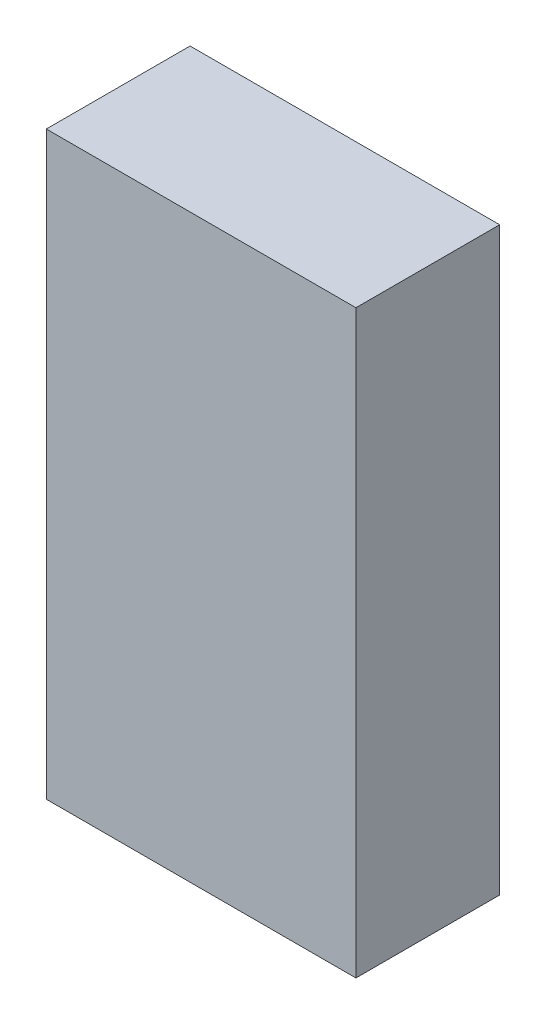
ISO-10303-21;
HEADER;
FILE_DESCRIPTION(('STEP AP214'),'2;1');
FILE_NAME('part.step','',(''),(''),'','','');
FILE_SCHEMA(('AUTOMOTIVE_DESIGN { 1 0 10303 214 1 1 1 1 }'));
ENDSEC;
DATA;
#1=APPLICATION_CONTEXT('core data for automotive mechanical design processes');
#2=APPLICATION_PROTOCOL_DEFINITION('international standard','automotive_design',2000,#1);
#3=PRODUCT_CONTEXT('',#1,'mechanical');
#4=PRODUCT('Part','Part','',(#3));
#5=PRODUCT_RELATED_PRODUCT_CATEGORY('part','',(#4));
#6=PRODUCT_DEFINITION_FORMATION('','',#4);
#7=PRODUCT_DEFINITION_CONTEXT('part definition',#1,'design');
#8=PRODUCT_DEFINITION('design','',#6,#7);
#9=PRODUCT_DEFINITION_SHAPE('','',#8);
#10=(LENGTH_UNIT() NAMED_UNIT(*) SI_UNIT(.MILLI.,.METRE.));
#11=(NAMED_UNIT(*) PLANE_ANGLE_UNIT() SI_UNIT($,.RADIAN.));
#12=(NAMED_UNIT(*) SI_UNIT($,.STERADIAN.) SOLID_ANGLE_UNIT());
#13=UNCERTAINTY_MEASURE_WITH_UNIT(LENGTH_MEASURE(1.E-05),#10,'distance_accuracy_value','');
#14=(GEOMETRIC_REPRESENTATION_CONTEXT(3) GLOBAL_UNCERTAINTY_ASSIGNED_CONTEXT((#13)) GLOBAL_UNIT_ASSIGNED_CONTEXT((#10,
#11,#12)) REPRESENTATION_CONTEXT('',''));
#15=CARTESIAN_POINT('',(0.,0.,0.));
#16=DIRECTION('',(0.,0.,1.));
#17=DIRECTION('',(1.,0.,0.));
#18=AXIS2_PLACEMENT_3D('',#15,#16,#17);
#19=CARTESIAN_POINT('',(-56.,105.,52.));
#20=DIRECTION('',(1.,0.,0.));
#21=DIRECTION('',(0.,1.,0.));
#22=AXIS2_PLACEMENT_3D('',#19,#20,#21);
#23=PLANE('',#22);
#24=DIRECTION('',(0.,-1.,0.));
#25=VECTOR('',#24,1.);
#26=CARTESIAN_POINT('',(-56.,105.,0.));
#27=LINE('',#26,#25);
#28=CARTESIAN_POINT('',(-56.,105.,0.));
#29=VERTEX_POINT('',#28);
#30=CARTESIAN_POINT('',(-56.,-105.,0.));
#31=VERTEX_POINT('',#30);
#32=EDGE_CURVE('E97',#29,#31,#27,.T.);
#33=ORIENTED_EDGE('',*,*,#32,.T.);
#34=DIRECTION('',(0.,0.,-1.));
#35=VECTOR('',#34,1.);
#36=CARTESIAN_POINT('',(-56.,-105.,52.));
#37=LINE('',#36,#35);
#38=CARTESIAN_POINT('',(-56.,-105.,52.));
#39=VERTEX_POINT('',#38);
#40=EDGE_CURVE('E11',#39,#31,#37,.T.);
#41=ORIENTED_EDGE('',*,*,#40,.F.);
#42=DIRECTION('',(0.,-1.,0.));
#43=VECTOR('',#42,1.);
#44=CARTESIAN_POINT('',(-56.,105.,52.));
#45=LINE('',#44,#43);
#46=CARTESIAN_POINT('',(-56.,105.,52.));
#47=VERTEX_POINT('',#46);
#48=EDGE_CURVE('E85',#47,#39,#45,.T.);
#49=ORIENTED_EDGE('',*,*,#48,.F.);
#50=DIRECTION('',(0.,0.,-1.));
#51=VECTOR('',#50,1.);
#52=CARTESIAN_POINT('',(-56.,105.,52.));
#53=LINE('',#52,#51);
#54=EDGE_CURVE('E93',#47,#29,#53,.T.);
#55=ORIENTED_EDGE('',*,*,#54,.T.);
#56=EDGE_LOOP('',(#33,#41,#49,#55));
#57=FACE_BOUND('',#56,.T.);
#58=ADVANCED_FACE('F34',(#57),#23,.F.);
#59=CARTESIAN_POINT('',(-56.,-105.,52.));
#60=DIRECTION('',(0.,1.,0.));
#61=DIRECTION('',(0.,0.,1.));
#62=AXIS2_PLACEMENT_3D('',#59,#60,#61);
#63=PLANE('',#62);
#64=DIRECTION('',(1.,0.,0.));
#65=VECTOR('',#64,1.);
#66=CARTESIAN_POINT('',(-56.,-105.,0.));
#67=LINE('',#66,#65);
#68=CARTESIAN_POINT('',(56.,-105.,0.));
#69=VERTEX_POINT('',#68);
#70=EDGE_CURVE('E89',#31,#69,#67,.T.);
#71=ORIENTED_EDGE('',*,*,#70,.T.);
#72=DIRECTION('',(0.,0.,-1.));
#73=VECTOR('',#72,1.);
#74=CARTESIAN_POINT('',(56.,-105.,52.));
#75=LINE('',#74,#73);
#76=CARTESIAN_POINT('',(56.,-105.,52.));
#77=VERTEX_POINT('',#76);
#78=EDGE_CURVE('E42',#77,#69,#75,.T.);
#79=ORIENTED_EDGE('',*,*,#78,.F.);
#80=DIRECTION('',(1.,0.,0.));
#81=VECTOR('',#80,1.);
#82=CARTESIAN_POINT('',(-56.,-105.,52.));
#83=LINE('',#82,#81);
#84=EDGE_CURVE('E80',#39,#77,#83,.T.);
#85=ORIENTED_EDGE('',*,*,#84,.F.);
#86=ORIENTED_EDGE('',*,*,#40,.T.);
#87=EDGE_LOOP('',(#71,#79,#85,#86));
#88=FACE_BOUND('',#87,.T.);
#89=ADVANCED_FACE('F88',(#88),#63,.F.);
#90=CARTESIAN_POINT('',(56.,105.,52.));
#91=DIRECTION('',(-1.,0.,0.));
#92=DIRECTION('',(0.,-1.,0.));
#93=AXIS2_PLACEMENT_3D('',#90,#91,#92);
#94=PLANE('',#93);
#95=DIRECTION('',(0.,1.,0.));
#96=VECTOR('',#95,1.);
#97=CARTESIAN_POINT('',(56.,105.,0.));
#98=LINE('',#97,#96);
#99=CARTESIAN_POINT('',(56.,105.,0.));
#100=VERTEX_POINT('',#99);
#101=EDGE_CURVE('E67',#69,#100,#98,.T.);
#102=ORIENTED_EDGE('',*,*,#101,.T.);
#103=DIRECTION('',(0.,0.,-1.));
#104=VECTOR('',#103,1.);
#105=CARTESIAN_POINT('',(56.,105.,52.));
#106=LINE('',#105,#104);
#107=CARTESIAN_POINT('',(56.,105.,52.));
#108=VERTEX_POINT('',#107);
#109=EDGE_CURVE('E90',#108,#100,#106,.T.);
#110=ORIENTED_EDGE('',*,*,#109,.F.);
#111=DIRECTION('',(0.,1.,0.));
#112=VECTOR('',#111,1.);
#113=CARTESIAN_POINT('',(56.,105.,52.));
#114=LINE('',#113,#112);
#115=EDGE_CURVE('E83',#77,#108,#114,.T.);
#116=ORIENTED_EDGE('',*,*,#115,.F.);
#117=ORIENTED_EDGE('',*,*,#78,.T.);
#118=EDGE_LOOP('',(#102,#110,#116,#117));
#119=FACE_BOUND('',#118,.T.);
#120=ADVANCED_FACE('F91',(#119),#94,.F.);
#121=CARTESIAN_POINT('',(-56.,105.,52.));
#122=DIRECTION('',(0.,-1.,0.));
#123=DIRECTION('',(0.,0.,-1.));
#124=AXIS2_PLACEMENT_3D('',#121,#122,#123);
#125=PLANE('',#124);
#126=DIRECTION('',(-1.,0.,0.));
#127=VECTOR('',#126,1.);
#128=CARTESIAN_POINT('',(-56.,105.,0.));
#129=LINE('',#128,#127);
#130=EDGE_CURVE('E73',#100,#29,#129,.T.);
#131=ORIENTED_EDGE('',*,*,#130,.T.);
#132=ORIENTED_EDGE('',*,*,#54,.F.);
#133=DIRECTION('',(-1.,0.,0.));
#134=VECTOR('',#133,1.);
#135=CARTESIAN_POINT('',(-56.,105.,52.));
#136=LINE('',#135,#134);
#137=EDGE_CURVE('E50',#108,#47,#136,.T.);
#138=ORIENTED_EDGE('',*,*,#137,.F.);
#139=ORIENTED_EDGE('',*,*,#109,.T.);
#140=EDGE_LOOP('',(#131,#132,#138,#139));
#141=FACE_BOUND('',#140,.T.);
#142=ADVANCED_FACE('F104',(#141),#125,.F.);
#143=CARTESIAN_POINT('',(0.,0.,52.));
#144=DIRECTION('',(0.,0.,1.));
#145=DIRECTION('',(1.,0.,0.));
#146=AXIS2_PLACEMENT_3D('',#143,#144,#145);
#147=PLANE('',#146);
#148=ORIENTED_EDGE('',*,*,#48,.T.);
#149=ORIENTED_EDGE('',*,*,#84,.T.);
#150=ORIENTED_EDGE('',*,*,#115,.T.);
#151=ORIENTED_EDGE('',*,*,#137,.T.);
#152=EDGE_LOOP('',(#148,#149,#150,#151));
#153=FACE_BOUND('',#152,.T.);
#154=ADVANCED_FACE('F81',(#153),#147,.T.);
#155=CARTESIAN_POINT('',(0.,0.,0.));
#156=DIRECTION('',(0.,0.,1.));
#157=DIRECTION('',(1.,0.,0.));
#158=AXIS2_PLACEMENT_3D('',#155,#156,#157);
#159=PLANE('',#158);
#160=ORIENTED_EDGE('',*,*,#32,.F.);
#161=ORIENTED_EDGE('',*,*,#130,.F.);
#162=ORIENTED_EDGE('',*,*,#101,.F.);
#163=ORIENTED_EDGE('',*,*,#70,.F.);
#164=EDGE_LOOP('',(#160,#161,#162,#163));
#165=FACE_BOUND('',#164,.T.);
#166=ADVANCED_FACE('F107',(#165),#159,.F.);
#167=CLOSED_SHELL('',(#58,#89,#120,#142,#154,#166));
#168=MANIFOLD_SOLID_BREP('B2',#167);
#169=ADVANCED_BREP_SHAPE_REPRESENTATION('',(#18,#168),#14);
#170=SHAPE_DEFINITION_REPRESENTATION(#9,#169);
ENDSEC;
END-ISO-10303-21;
